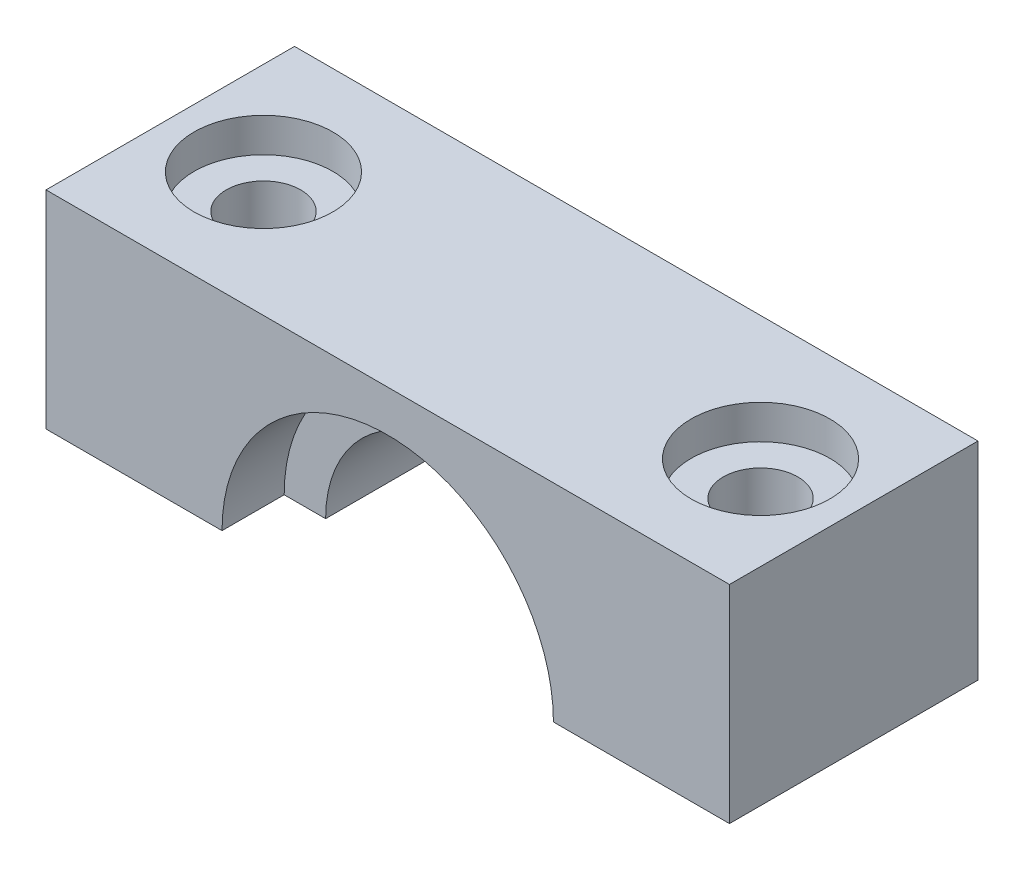
ISO-10303-21;
HEADER;
FILE_DESCRIPTION(('STEP AP214'),'2;1');
FILE_NAME('part.step','',(''),(''),'','','');
FILE_SCHEMA(('AUTOMOTIVE_DESIGN { 1 0 10303 214 1 1 1 1 }'));
ENDSEC;
DATA;
#1=APPLICATION_CONTEXT('core data for automotive mechanical design processes');
#2=APPLICATION_PROTOCOL_DEFINITION('international standard','automotive_design',2000,#1);
#3=PRODUCT_CONTEXT('',#1,'mechanical');
#4=PRODUCT('Part','Part','',(#3));
#5=PRODUCT_RELATED_PRODUCT_CATEGORY('part','',(#4));
#6=PRODUCT_DEFINITION_FORMATION('','',#4);
#7=PRODUCT_DEFINITION_CONTEXT('part definition',#1,'design');
#8=PRODUCT_DEFINITION('design','',#6,#7);
#9=PRODUCT_DEFINITION_SHAPE('','',#8);
#10=(LENGTH_UNIT() NAMED_UNIT(*) SI_UNIT(.MILLI.,.METRE.));
#11=(NAMED_UNIT(*) PLANE_ANGLE_UNIT() SI_UNIT($,.RADIAN.));
#12=(NAMED_UNIT(*) SI_UNIT($,.STERADIAN.) SOLID_ANGLE_UNIT());
#13=UNCERTAINTY_MEASURE_WITH_UNIT(LENGTH_MEASURE(1.E-05),#10,'distance_accuracy_value','');
#14=(GEOMETRIC_REPRESENTATION_CONTEXT(3) GLOBAL_UNCERTAINTY_ASSIGNED_CONTEXT((#13)) GLOBAL_UNIT_ASSIGNED_CONTEXT((#10,
#11,#12)) REPRESENTATION_CONTEXT('',''));
#15=CARTESIAN_POINT('',(0.,0.,0.));
#16=DIRECTION('',(0.,0.,1.));
#17=DIRECTION('',(1.,0.,0.));
#18=AXIS2_PLACEMENT_3D('',#15,#16,#17);
#19=CARTESIAN_POINT('',(0.,0.,0.));
#20=DIRECTION('',(0.,-1.,0.));
#21=DIRECTION('',(0.,0.,-1.));
#22=AXIS2_PLACEMENT_3D('',#19,#20,#21);
#23=PLANE('',#22);
#24=CARTESIAN_POINT('',(-12.,0.,0.));
#25=DIRECTION('',(0.,1.,0.));
#26=DIRECTION('',(0.,0.,1.));
#27=AXIS2_PLACEMENT_3D('',#24,#25,#26);
#28=CIRCLE('',#27,1.8);
#29=CARTESIAN_POINT('',(-12.,0.,1.79999999999999));
#30=VERTEX_POINT('',#29);
#31=EDGE_CURVE('E286',#30,#30,#28,.T.);
#32=ORIENTED_EDGE('',*,*,#31,.T.);
#33=EDGE_LOOP('',(#32));
#34=FACE_BOUND('',#33,.T.);
#35=DIRECTION('',(0.,0.,-1.));
#36=VECTOR('',#35,1.);
#37=CARTESIAN_POINT('',(-8.,0.,-6.));
#38=LINE('',#37,#36);
#39=CARTESIAN_POINT('',(-8.,0.,-3.));
#40=VERTEX_POINT('',#39);
#41=CARTESIAN_POINT('',(-8.,0.,-6.));
#42=VERTEX_POINT('',#41);
#43=EDGE_CURVE('E11',#40,#42,#38,.T.);
#44=ORIENTED_EDGE('',*,*,#43,.F.);
#45=DIRECTION('',(1.,0.,0.));
#46=VECTOR('',#45,1.);
#47=CARTESIAN_POINT('',(0.,0.,-3.));
#48=LINE('',#47,#46);
#49=CARTESIAN_POINT('',(-6.,0.,-3.));
#50=VERTEX_POINT('',#49);
#51=EDGE_CURVE('E41',#40,#50,#48,.T.);
#52=ORIENTED_EDGE('',*,*,#51,.T.);
#53=DIRECTION('',(0.,0.,-1.));
#54=VECTOR('',#53,1.);
#55=CARTESIAN_POINT('',(-6.,0.,-6.));
#56=LINE('',#55,#54);
#57=CARTESIAN_POINT('',(-6.,0.,3.));
#58=VERTEX_POINT('',#57);
#59=EDGE_CURVE('E170',#50,#58,#56,.F.);
#60=ORIENTED_EDGE('',*,*,#59,.T.);
#61=DIRECTION('',(1.,0.,0.));
#62=VECTOR('',#61,1.);
#63=CARTESIAN_POINT('',(0.,0.,3.));
#64=LINE('',#63,#62);
#65=CARTESIAN_POINT('',(-8.,0.,3.));
#66=VERTEX_POINT('',#65);
#67=EDGE_CURVE('E132',#66,#58,#64,.T.);
#68=ORIENTED_EDGE('',*,*,#67,.F.);
#69=DIRECTION('',(0.,0.,-1.));
#70=VECTOR('',#69,1.);
#71=CARTESIAN_POINT('',(-8.,0.,-6.));
#72=LINE('',#71,#70);
#73=CARTESIAN_POINT('',(-8.,0.,6.));
#74=VERTEX_POINT('',#73);
#75=EDGE_CURVE('E119',#66,#74,#72,.F.);
#76=ORIENTED_EDGE('',*,*,#75,.T.);
#77=DIRECTION('',(-1.,0.,0.));
#78=VECTOR('',#77,1.);
#79=CARTESIAN_POINT('',(16.5,0.,6.));
#80=LINE('',#79,#78);
#81=CARTESIAN_POINT('',(-16.5,0.,6.));
#82=VERTEX_POINT('',#81);
#83=EDGE_CURVE('E130',#74,#82,#80,.T.);
#84=ORIENTED_EDGE('',*,*,#83,.T.);
#85=DIRECTION('',(0.,0.,-1.));
#86=VECTOR('',#85,1.);
#87=CARTESIAN_POINT('',(-16.5,0.,6.));
#88=LINE('',#87,#86);
#89=CARTESIAN_POINT('',(-16.5,0.,-6.));
#90=VERTEX_POINT('',#89);
#91=EDGE_CURVE('E138',#82,#90,#88,.T.);
#92=ORIENTED_EDGE('',*,*,#91,.T.);
#93=DIRECTION('',(-1.,0.,0.));
#94=VECTOR('',#93,1.);
#95=CARTESIAN_POINT('',(16.5,0.,-6.));
#96=LINE('',#95,#94);
#97=EDGE_CURVE('E146',#42,#90,#96,.T.);
#98=ORIENTED_EDGE('',*,*,#97,.F.);
#99=EDGE_LOOP('',(#44,#52,#60,#68,#76,#84,#92,#98));
#100=FACE_BOUND('',#99,.T.);
#101=ADVANCED_FACE('F33',(#34,#100),#23,.T.);
#102=CARTESIAN_POINT('',(16.5,10.,6.));
#103=DIRECTION('',(0.,0.,1.));
#104=DIRECTION('',(1.,0.,0.));
#105=AXIS2_PLACEMENT_3D('',#102,#103,#104);
#106=PLANE('',#105);
#107=ORIENTED_EDGE('',*,*,#83,.F.);
#108=CARTESIAN_POINT('',(0.,0.,6.));
#109=DIRECTION('',(0.,0.,-1.));
#110=DIRECTION('',(-1.,0.,0.));
#111=AXIS2_PLACEMENT_3D('',#108,#109,#110);
#112=CIRCLE('',#111,8.);
#113=CARTESIAN_POINT('',(8.,0.,6.));
#114=VERTEX_POINT('',#113);
#115=EDGE_CURVE('E116',#74,#114,#112,.T.);
#116=ORIENTED_EDGE('',*,*,#115,.T.);
#117=CARTESIAN_POINT('',(16.5,0.,6.));
#118=VERTEX_POINT('',#117);
#119=EDGE_CURVE('E135',#118,#114,#80,.T.);
#120=ORIENTED_EDGE('',*,*,#119,.F.);
#121=DIRECTION('',(0.,-1.,0.));
#122=VECTOR('',#121,1.);
#123=CARTESIAN_POINT('',(16.5,10.,6.));
#124=LINE('',#123,#122);
#125=CARTESIAN_POINT('',(16.5,10.,6.));
#126=VERTEX_POINT('',#125);
#127=EDGE_CURVE('E57',#126,#118,#124,.T.);
#128=ORIENTED_EDGE('',*,*,#127,.F.);
#129=DIRECTION('',(-1.,0.,0.));
#130=VECTOR('',#129,1.);
#131=CARTESIAN_POINT('',(16.5,10.,6.));
#132=LINE('',#131,#130);
#133=CARTESIAN_POINT('',(-16.5,10.,6.));
#134=VERTEX_POINT('',#133);
#135=EDGE_CURVE('E152',#126,#134,#132,.T.);
#136=ORIENTED_EDGE('',*,*,#135,.T.);
#137=DIRECTION('',(0.,-1.,0.));
#138=VECTOR('',#137,1.);
#139=CARTESIAN_POINT('',(-16.5,10.,6.));
#140=LINE('',#139,#138);
#141=EDGE_CURVE('E83',#134,#82,#140,.T.);
#142=ORIENTED_EDGE('',*,*,#141,.T.);
#143=EDGE_LOOP('',(#107,#116,#120,#128,#136,#142));
#144=FACE_BOUND('',#143,.T.);
#145=ADVANCED_FACE('F35',(#144),#106,.T.);
#146=CARTESIAN_POINT('',(16.5,10.,6.));
#147=DIRECTION('',(-1.,0.,0.));
#148=DIRECTION('',(0.,0.,1.));
#149=AXIS2_PLACEMENT_3D('',#146,#147,#148);
#150=PLANE('',#149);
#151=DIRECTION('',(0.,0.,-1.));
#152=VECTOR('',#151,1.);
#153=CARTESIAN_POINT('',(16.5,0.,6.));
#154=LINE('',#153,#152);
#155=CARTESIAN_POINT('',(16.5,0.,-6.));
#156=VERTEX_POINT('',#155);
#157=EDGE_CURVE('E150',#118,#156,#154,.T.);
#158=ORIENTED_EDGE('',*,*,#157,.T.);
#159=DIRECTION('',(0.,-1.,0.));
#160=VECTOR('',#159,1.);
#161=CARTESIAN_POINT('',(16.5,10.,-6.));
#162=LINE('',#161,#160);
#163=CARTESIAN_POINT('',(16.5,10.,-6.));
#164=VERTEX_POINT('',#163);
#165=EDGE_CURVE('E154',#164,#156,#162,.T.);
#166=ORIENTED_EDGE('',*,*,#165,.F.);
#167=DIRECTION('',(0.,0.,-1.));
#168=VECTOR('',#167,1.);
#169=CARTESIAN_POINT('',(16.5,10.,6.));
#170=LINE('',#169,#168);
#171=EDGE_CURVE('E143',#126,#164,#170,.T.);
#172=ORIENTED_EDGE('',*,*,#171,.F.);
#173=ORIENTED_EDGE('',*,*,#127,.T.);
#174=EDGE_LOOP('',(#158,#166,#172,#173));
#175=FACE_BOUND('',#174,.T.);
#176=ADVANCED_FACE('F198',(#175),#150,.F.);
#177=CARTESIAN_POINT('',(16.5,10.,-6.));
#178=DIRECTION('',(0.,0.,1.));
#179=DIRECTION('',(1.,0.,0.));
#180=AXIS2_PLACEMENT_3D('',#177,#178,#179);
#181=PLANE('',#180);
#182=CARTESIAN_POINT('',(8.,0.,-6.));
#183=VERTEX_POINT('',#182);
#184=EDGE_CURVE('E147',#156,#183,#96,.T.);
#185=ORIENTED_EDGE('',*,*,#184,.T.);
#186=CARTESIAN_POINT('',(0.,0.,-6.));
#187=DIRECTION('',(0.,0.,-1.));
#188=DIRECTION('',(-1.,0.,0.));
#189=AXIS2_PLACEMENT_3D('',#186,#187,#188);
#190=CIRCLE('',#189,8.);
#191=EDGE_CURVE('E136',#42,#183,#190,.T.);
#192=ORIENTED_EDGE('',*,*,#191,.F.);
#193=ORIENTED_EDGE('',*,*,#97,.T.);
#194=DIRECTION('',(0.,-1.,0.));
#195=VECTOR('',#194,1.);
#196=CARTESIAN_POINT('',(-16.5,10.,-6.));
#197=LINE('',#196,#195);
#198=CARTESIAN_POINT('',(-16.5,10.,-6.));
#199=VERTEX_POINT('',#198);
#200=EDGE_CURVE('E157',#199,#90,#197,.T.);
#201=ORIENTED_EDGE('',*,*,#200,.F.);
#202=DIRECTION('',(-1.,0.,0.));
#203=VECTOR('',#202,1.);
#204=CARTESIAN_POINT('',(16.5,10.,-6.));
#205=LINE('',#204,#203);
#206=EDGE_CURVE('E191',#164,#199,#205,.T.);
#207=ORIENTED_EDGE('',*,*,#206,.F.);
#208=ORIENTED_EDGE('',*,*,#165,.T.);
#209=EDGE_LOOP('',(#185,#192,#193,#201,#207,#208));
#210=FACE_BOUND('',#209,.T.);
#211=ADVANCED_FACE('F201',(#210),#181,.F.);
#212=CARTESIAN_POINT('',(-16.5,10.,6.));
#213=DIRECTION('',(-1.,0.,0.));
#214=DIRECTION('',(0.,0.,1.));
#215=AXIS2_PLACEMENT_3D('',#212,#213,#214);
#216=PLANE('',#215);
#217=ORIENTED_EDGE('',*,*,#91,.F.);
#218=ORIENTED_EDGE('',*,*,#141,.F.);
#219=DIRECTION('',(0.,0.,-1.));
#220=VECTOR('',#219,1.);
#221=CARTESIAN_POINT('',(-16.5,10.,6.));
#222=LINE('',#221,#220);
#223=EDGE_CURVE('E190',#134,#199,#222,.T.);
#224=ORIENTED_EDGE('',*,*,#223,.T.);
#225=ORIENTED_EDGE('',*,*,#200,.T.);
#226=EDGE_LOOP('',(#217,#218,#224,#225));
#227=FACE_BOUND('',#226,.T.);
#228=ADVANCED_FACE('F204',(#227),#216,.T.);
#229=CARTESIAN_POINT('',(0.,10.,0.));
#230=DIRECTION('',(0.,-1.,0.));
#231=DIRECTION('',(0.,0.,-1.));
#232=AXIS2_PLACEMENT_3D('',#229,#230,#231);
#233=PLANE('',#232);
#234=CARTESIAN_POINT('',(-12.,10.,0.));
#235=DIRECTION('',(0.,1.,0.));
#236=DIRECTION('',(0.,0.,1.));
#237=AXIS2_PLACEMENT_3D('',#234,#235,#236);
#238=CIRCLE('',#237,3.35);
#239=CARTESIAN_POINT('',(-12.,10.,3.35));
#240=VERTEX_POINT('',#239);
#241=EDGE_CURVE('E279',#240,#240,#238,.T.);
#242=ORIENTED_EDGE('',*,*,#241,.F.);
#243=EDGE_LOOP('',(#242));
#244=FACE_BOUND('',#243,.T.);
#245=CARTESIAN_POINT('',(12.,10.,0.));
#246=DIRECTION('',(0.,1.,0.));
#247=DIRECTION('',(0.,0.,1.));
#248=AXIS2_PLACEMENT_3D('',#245,#246,#247);
#249=CIRCLE('',#248,3.35);
#250=CARTESIAN_POINT('',(12.,10.,3.35));
#251=VERTEX_POINT('',#250);
#252=EDGE_CURVE('E288',#251,#251,#249,.T.);
#253=ORIENTED_EDGE('',*,*,#252,.F.);
#254=EDGE_LOOP('',(#253));
#255=FACE_BOUND('',#254,.T.);
#256=ORIENTED_EDGE('',*,*,#135,.F.);
#257=ORIENTED_EDGE('',*,*,#171,.T.);
#258=ORIENTED_EDGE('',*,*,#206,.T.);
#259=ORIENTED_EDGE('',*,*,#223,.F.);
#260=EDGE_LOOP('',(#256,#257,#258,#259));
#261=FACE_BOUND('',#260,.T.);
#262=ADVANCED_FACE('F197',(#244,#255,#261),#233,.F.);
#263=CARTESIAN_POINT('',(12.,0.,0.));
#264=DIRECTION('',(0.,1.,0.));
#265=DIRECTION('',(0.,0.,1.));
#266=AXIS2_PLACEMENT_3D('',#263,#264,#265);
#267=CIRCLE('',#266,1.8);
#268=CARTESIAN_POINT('',(12.,0.,1.8));
#269=VERTEX_POINT('',#268);
#270=EDGE_CURVE('E124',#269,#269,#267,.T.);
#271=ORIENTED_EDGE('',*,*,#270,.T.);
#272=EDGE_LOOP('',(#271));
#273=FACE_BOUND('',#272,.T.);
#274=DIRECTION('',(0.,0.,-1.));
#275=VECTOR('',#274,1.);
#276=CARTESIAN_POINT('',(8.,0.,-6.));
#277=LINE('',#276,#275);
#278=CARTESIAN_POINT('',(8.,0.,-3.));
#279=VERTEX_POINT('',#278);
#280=EDGE_CURVE('E133',#183,#279,#277,.F.);
#281=ORIENTED_EDGE('',*,*,#280,.F.);
#282=ORIENTED_EDGE('',*,*,#184,.F.);
#283=ORIENTED_EDGE('',*,*,#157,.F.);
#284=ORIENTED_EDGE('',*,*,#119,.T.);
#285=DIRECTION('',(0.,0.,-1.));
#286=VECTOR('',#285,1.);
#287=CARTESIAN_POINT('',(8.,0.,-6.));
#288=LINE('',#287,#286);
#289=CARTESIAN_POINT('',(8.,0.,3.));
#290=VERTEX_POINT('',#289);
#291=EDGE_CURVE('E121',#114,#290,#288,.T.);
#292=ORIENTED_EDGE('',*,*,#291,.T.);
#293=CARTESIAN_POINT('',(6.,0.,3.));
#294=VERTEX_POINT('',#293);
#295=EDGE_CURVE('E162',#294,#290,#64,.T.);
#296=ORIENTED_EDGE('',*,*,#295,.F.);
#297=DIRECTION('',(0.,0.,-1.));
#298=VECTOR('',#297,1.);
#299=CARTESIAN_POINT('',(6.,0.,-6.));
#300=LINE('',#299,#298);
#301=CARTESIAN_POINT('',(6.,0.,-3.));
#302=VERTEX_POINT('',#301);
#303=EDGE_CURVE('E164',#294,#302,#300,.T.);
#304=ORIENTED_EDGE('',*,*,#303,.T.);
#305=EDGE_CURVE('E167',#302,#279,#48,.T.);
#306=ORIENTED_EDGE('',*,*,#305,.T.);
#307=EDGE_LOOP('',(#281,#282,#283,#284,#292,#296,#304,#306));
#308=FACE_BOUND('',#307,.T.);
#309=ADVANCED_FACE('F210',(#273,#308),#23,.T.);
#310=CARTESIAN_POINT('',(0.,0.,-6.));
#311=DIRECTION('',(0.,0.,-1.));
#312=DIRECTION('',(-1.,0.,0.));
#313=AXIS2_PLACEMENT_3D('',#310,#311,#312);
#314=CYLINDRICAL_SURFACE('',#313,8.);
#315=ORIENTED_EDGE('',*,*,#43,.T.);
#316=ORIENTED_EDGE('',*,*,#191,.T.);
#317=ORIENTED_EDGE('',*,*,#280,.T.);
#318=CARTESIAN_POINT('',(0.,0.,-3.));
#319=DIRECTION('',(0.,0.,-1.));
#320=DIRECTION('',(-1.,0.,0.));
#321=AXIS2_PLACEMENT_3D('',#318,#319,#320);
#322=CIRCLE('',#321,8.);
#323=EDGE_CURVE('E139',#40,#279,#322,.T.);
#324=ORIENTED_EDGE('',*,*,#323,.F.);
#325=EDGE_LOOP('',(#315,#316,#317,#324));
#326=FACE_BOUND('',#325,.T.);
#327=ADVANCED_FACE('F223',(#326),#314,.F.);
#328=CARTESIAN_POINT('',(0.,0.,-3.));
#329=DIRECTION('',(0.,0.,-1.));
#330=DIRECTION('',(-1.,0.,0.));
#331=AXIS2_PLACEMENT_3D('',#328,#329,#330);
#332=PLANE('',#331);
#333=ORIENTED_EDGE('',*,*,#323,.T.);
#334=ORIENTED_EDGE('',*,*,#305,.F.);
#335=CARTESIAN_POINT('',(0.,0.,-3.));
#336=DIRECTION('',(0.,0.,-1.));
#337=DIRECTION('',(-1.,0.,0.));
#338=AXIS2_PLACEMENT_3D('',#335,#336,#337);
#339=CIRCLE('',#338,6.);
#340=EDGE_CURVE('E182',#50,#302,#339,.T.);
#341=ORIENTED_EDGE('',*,*,#340,.F.);
#342=ORIENTED_EDGE('',*,*,#51,.F.);
#343=EDGE_LOOP('',(#333,#334,#341,#342));
#344=FACE_BOUND('',#343,.T.);
#345=ADVANCED_FACE('F228',(#344),#332,.T.);
#346=CARTESIAN_POINT('',(0.,0.,-6.));
#347=DIRECTION('',(0.,0.,-1.));
#348=DIRECTION('',(-1.,0.,0.));
#349=AXIS2_PLACEMENT_3D('',#346,#347,#348);
#350=CYLINDRICAL_SURFACE('',#349,6.);
#351=ORIENTED_EDGE('',*,*,#340,.T.);
#352=ORIENTED_EDGE('',*,*,#303,.F.);
#353=CARTESIAN_POINT('',(0.,0.,3.));
#354=DIRECTION('',(0.,0.,-1.));
#355=DIRECTION('',(-1.,0.,0.));
#356=AXIS2_PLACEMENT_3D('',#353,#354,#355);
#357=CIRCLE('',#356,6.);
#358=EDGE_CURVE('E176',#58,#294,#357,.T.);
#359=ORIENTED_EDGE('',*,*,#358,.F.);
#360=ORIENTED_EDGE('',*,*,#59,.F.);
#361=EDGE_LOOP('',(#351,#352,#359,#360));
#362=FACE_BOUND('',#361,.T.);
#363=ADVANCED_FACE('F180',(#362),#350,.F.);
#364=CARTESIAN_POINT('',(0.,0.,3.));
#365=DIRECTION('',(0.,0.,-1.));
#366=DIRECTION('',(-1.,0.,0.));
#367=AXIS2_PLACEMENT_3D('',#364,#365,#366);
#368=PLANE('',#367);
#369=ORIENTED_EDGE('',*,*,#67,.T.);
#370=ORIENTED_EDGE('',*,*,#358,.T.);
#371=ORIENTED_EDGE('',*,*,#295,.T.);
#372=CARTESIAN_POINT('',(0.,0.,3.));
#373=DIRECTION('',(0.,0.,-1.));
#374=DIRECTION('',(-1.,0.,0.));
#375=AXIS2_PLACEMENT_3D('',#372,#373,#374);
#376=CIRCLE('',#375,8.);
#377=EDGE_CURVE('E48',#66,#290,#376,.T.);
#378=ORIENTED_EDGE('',*,*,#377,.F.);
#379=EDGE_LOOP('',(#369,#370,#371,#378));
#380=FACE_BOUND('',#379,.T.);
#381=ADVANCED_FACE('F175',(#380),#368,.F.);
#382=CARTESIAN_POINT('',(0.,0.,-6.));
#383=DIRECTION('',(0.,0.,-1.));
#384=DIRECTION('',(-1.,0.,0.));
#385=AXIS2_PLACEMENT_3D('',#382,#383,#384);
#386=CYLINDRICAL_SURFACE('',#385,8.);
#387=ORIENTED_EDGE('',*,*,#377,.T.);
#388=ORIENTED_EDGE('',*,*,#291,.F.);
#389=ORIENTED_EDGE('',*,*,#115,.F.);
#390=ORIENTED_EDGE('',*,*,#75,.F.);
#391=EDGE_LOOP('',(#387,#388,#389,#390));
#392=FACE_BOUND('',#391,.T.);
#393=ADVANCED_FACE('F118',(#392),#386,.F.);
#394=CARTESIAN_POINT('',(12.,10.,0.));
#395=DIRECTION('',(0.,1.,0.));
#396=DIRECTION('',(0.,0.,1.));
#397=AXIS2_PLACEMENT_3D('',#394,#395,#396);
#398=CYLINDRICAL_SURFACE('',#397,1.8);
#399=ORIENTED_EDGE('',*,*,#270,.F.);
#400=EDGE_LOOP('',(#399));
#401=FACE_BOUND('',#400,.T.);
#402=CARTESIAN_POINT('',(12.,8.35,0.));
#403=DIRECTION('',(0.,1.,0.));
#404=DIRECTION('',(0.,0.,1.));
#405=AXIS2_PLACEMENT_3D('',#402,#403,#404);
#406=CIRCLE('',#405,1.8);
#407=CARTESIAN_POINT('',(12.,8.35,1.8));
#408=VERTEX_POINT('',#407);
#409=EDGE_CURVE('E294',#408,#408,#406,.T.);
#410=ORIENTED_EDGE('',*,*,#409,.T.);
#411=EDGE_LOOP('',(#410));
#412=FACE_BOUND('',#411,.T.);
#413=ADVANCED_FACE('F248',(#401,#412),#398,.F.);
#414=CARTESIAN_POINT('',(13.8,8.35,0.));
#415=DIRECTION('',(0.,-1.,0.));
#416=DIRECTION('',(0.,0.,-1.));
#417=AXIS2_PLACEMENT_3D('',#414,#415,#416);
#418=PLANE('',#417);
#419=ORIENTED_EDGE('',*,*,#409,.F.);
#420=EDGE_LOOP('',(#419));
#421=FACE_BOUND('',#420,.T.);
#422=CARTESIAN_POINT('',(12.,8.35,0.));
#423=DIRECTION('',(0.,1.,0.));
#424=DIRECTION('',(0.,0.,1.));
#425=AXIS2_PLACEMENT_3D('',#422,#423,#424);
#426=CIRCLE('',#425,3.35);
#427=CARTESIAN_POINT('',(12.,8.35,3.35));
#428=VERTEX_POINT('',#427);
#429=EDGE_CURVE('E291',#428,#428,#426,.T.);
#430=ORIENTED_EDGE('',*,*,#429,.T.);
#431=EDGE_LOOP('',(#430));
#432=FACE_BOUND('',#431,.T.);
#433=ADVANCED_FACE('F251',(#421,#432),#418,.F.);
#434=CARTESIAN_POINT('',(12.,10.,0.));
#435=DIRECTION('',(0.,1.,0.));
#436=DIRECTION('',(0.,0.,1.));
#437=AXIS2_PLACEMENT_3D('',#434,#435,#436);
#438=CYLINDRICAL_SURFACE('',#437,3.35);
#439=ORIENTED_EDGE('',*,*,#429,.F.);
#440=EDGE_LOOP('',(#439));
#441=FACE_BOUND('',#440,.T.);
#442=ORIENTED_EDGE('',*,*,#252,.T.);
#443=EDGE_LOOP('',(#442));
#444=FACE_BOUND('',#443,.T.);
#445=ADVANCED_FACE('F255',(#441,#444),#438,.F.);
#446=CARTESIAN_POINT('',(-12.,10.,0.));
#447=DIRECTION('',(0.,1.,0.));
#448=DIRECTION('',(0.,0.,1.));
#449=AXIS2_PLACEMENT_3D('',#446,#447,#448);
#450=CYLINDRICAL_SURFACE('',#449,1.8);
#451=ORIENTED_EDGE('',*,*,#31,.F.);
#452=EDGE_LOOP('',(#451));
#453=FACE_BOUND('',#452,.T.);
#454=CARTESIAN_POINT('',(-12.,8.35,0.));
#455=DIRECTION('',(0.,1.,0.));
#456=DIRECTION('',(0.,0.,1.));
#457=AXIS2_PLACEMENT_3D('',#454,#455,#456);
#458=CIRCLE('',#457,1.8);
#459=CARTESIAN_POINT('',(-12.,8.35,1.8));
#460=VERTEX_POINT('',#459);
#461=EDGE_CURVE('E281',#460,#460,#458,.T.);
#462=ORIENTED_EDGE('',*,*,#461,.T.);
#463=EDGE_LOOP('',(#462));
#464=FACE_BOUND('',#463,.T.);
#465=ADVANCED_FACE('F259',(#453,#464),#450,.F.);
#466=CARTESIAN_POINT('',(-10.2,8.35,0.));
#467=DIRECTION('',(0.,-1.,0.));
#468=DIRECTION('',(0.,0.,-1.));
#469=AXIS2_PLACEMENT_3D('',#466,#467,#468);
#470=PLANE('',#469);
#471=ORIENTED_EDGE('',*,*,#461,.F.);
#472=EDGE_LOOP('',(#471));
#473=FACE_BOUND('',#472,.T.);
#474=CARTESIAN_POINT('',(-12.,8.35,0.));
#475=DIRECTION('',(0.,1.,0.));
#476=DIRECTION('',(0.,0.,1.));
#477=AXIS2_PLACEMENT_3D('',#474,#475,#476);
#478=CIRCLE('',#477,3.35);
#479=CARTESIAN_POINT('',(-12.,8.35,3.35));
#480=VERTEX_POINT('',#479);
#481=EDGE_CURVE('E276',#480,#480,#478,.T.);
#482=ORIENTED_EDGE('',*,*,#481,.T.);
#483=EDGE_LOOP('',(#482));
#484=FACE_BOUND('',#483,.T.);
#485=ADVANCED_FACE('F263',(#473,#484),#470,.F.);
#486=CARTESIAN_POINT('',(-12.,10.,0.));
#487=DIRECTION('',(0.,1.,0.));
#488=DIRECTION('',(0.,0.,1.));
#489=AXIS2_PLACEMENT_3D('',#486,#487,#488);
#490=CYLINDRICAL_SURFACE('',#489,3.35);
#491=ORIENTED_EDGE('',*,*,#481,.F.);
#492=EDGE_LOOP('',(#491));
#493=FACE_BOUND('',#492,.T.);
#494=ORIENTED_EDGE('',*,*,#241,.T.);
#495=EDGE_LOOP('',(#494));
#496=FACE_BOUND('',#495,.T.);
#497=ADVANCED_FACE('F267',(#493,#496),#490,.F.);
#498=CLOSED_SHELL('',(#101,#145,#176,#211,#228,#262,#309,#327,#345,#363,#381,#393,#413,#433,
#445,#465,#485,#497));
#499=MANIFOLD_SOLID_BREP('B2',#498);
#500=ADVANCED_BREP_SHAPE_REPRESENTATION('',(#18,#499),#14);
#501=SHAPE_DEFINITION_REPRESENTATION(#9,#500);
ENDSEC;
END-ISO-10303-21;
